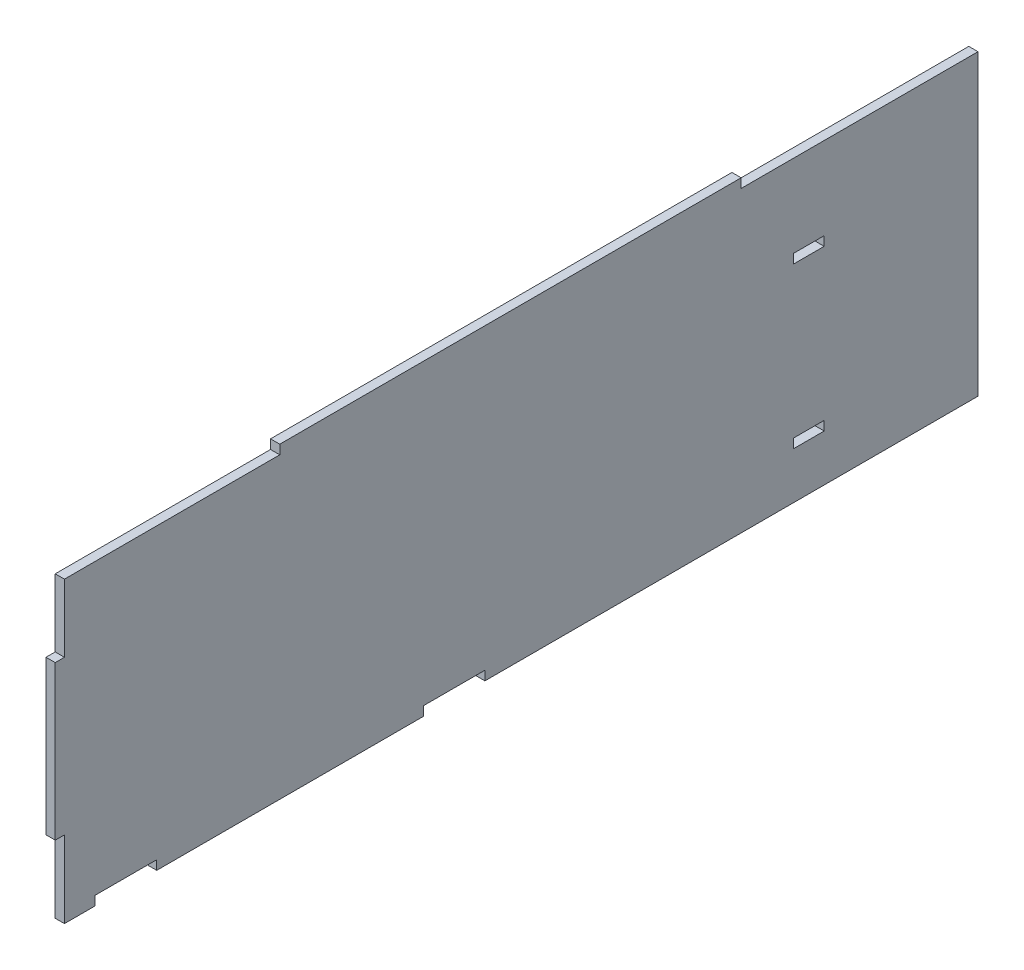
ISO-10303-21;
HEADER;
FILE_DESCRIPTION(('STEP AP214'),'2;1');
FILE_NAME('part.step','',(''),(''),'','','');
FILE_SCHEMA(('AUTOMOTIVE_DESIGN { 1 0 10303 214 1 1 1 1 }'));
ENDSEC;
DATA;
#1=APPLICATION_CONTEXT('core data for automotive mechanical design processes');
#2=APPLICATION_PROTOCOL_DEFINITION('international standard','automotive_design',2000,#1);
#3=PRODUCT_CONTEXT('',#1,'mechanical');
#4=PRODUCT('Part','Part','',(#3));
#5=PRODUCT_RELATED_PRODUCT_CATEGORY('part','',(#4));
#6=PRODUCT_DEFINITION_FORMATION('','',#4);
#7=PRODUCT_DEFINITION_CONTEXT('part definition',#1,'design');
#8=PRODUCT_DEFINITION('design','',#6,#7);
#9=PRODUCT_DEFINITION_SHAPE('','',#8);
#10=(LENGTH_UNIT() NAMED_UNIT(*) SI_UNIT(.MILLI.,.METRE.));
#11=(NAMED_UNIT(*) PLANE_ANGLE_UNIT() SI_UNIT($,.RADIAN.));
#12=(NAMED_UNIT(*) SI_UNIT($,.STERADIAN.) SOLID_ANGLE_UNIT());
#13=UNCERTAINTY_MEASURE_WITH_UNIT(LENGTH_MEASURE(1.E-05),#10,'distance_accuracy_value','');
#14=(GEOMETRIC_REPRESENTATION_CONTEXT(3) GLOBAL_UNCERTAINTY_ASSIGNED_CONTEXT((#13)) GLOBAL_UNIT_ASSIGNED_CONTEXT((#10,
#11,#12)) REPRESENTATION_CONTEXT('',''));
#15=CARTESIAN_POINT('',(0.,0.,0.));
#16=DIRECTION('',(0.,0.,1.));
#17=DIRECTION('',(1.,0.,0.));
#18=AXIS2_PLACEMENT_3D('',#15,#16,#17);
#19=CARTESIAN_POINT('',(0.,-29.636517170123,123.701897001304));
#20=DIRECTION('',(0.,0.,1.));
#21=DIRECTION('',(1.,0.,0.));
#22=AXIS2_PLACEMENT_3D('',#19,#20,#21);
#23=PLANE('',#22);
#24=DIRECTION('',(0.,-1.,0.));
#25=VECTOR('',#24,1.);
#26=CARTESIAN_POINT('',(3.,-29.636517170123,123.701897001304));
#27=LINE('',#26,#25);
#28=CARTESIAN_POINT('',(3.,-29.636517170123,123.701897001304));
#29=VERTEX_POINT('',#28);
#30=CARTESIAN_POINT('',(3.,-54.636517170123,123.701897001304));
#31=VERTEX_POINT('',#30);
#32=EDGE_CURVE('E280',#29,#31,#27,.T.);
#33=ORIENTED_EDGE('',*,*,#32,.F.);
#34=DIRECTION('',(1.,0.,0.));
#35=VECTOR('',#34,1.);
#36=CARTESIAN_POINT('',(0.,-29.636517170123,123.701897001304));
#37=LINE('',#36,#35);
#38=CARTESIAN_POINT('',(0.,-29.636517170123,123.701897001304));
#39=VERTEX_POINT('',#38);
#40=EDGE_CURVE('E11',#39,#29,#37,.T.);
#41=ORIENTED_EDGE('',*,*,#40,.F.);
#42=DIRECTION('',(0.,-1.,0.));
#43=VECTOR('',#42,1.);
#44=CARTESIAN_POINT('',(0.,-29.636517170123,123.701897001304));
#45=LINE('',#44,#43);
#46=CARTESIAN_POINT('',(0.,-54.636517170123,123.701897001304));
#47=VERTEX_POINT('',#46);
#48=EDGE_CURVE('E287',#39,#47,#45,.T.);
#49=ORIENTED_EDGE('',*,*,#48,.T.);
#50=DIRECTION('',(1.,0.,0.));
#51=VECTOR('',#50,1.);
#52=CARTESIAN_POINT('',(0.,-54.636517170123,123.701897001304));
#53=LINE('',#52,#51);
#54=EDGE_CURVE('E36',#47,#31,#53,.T.);
#55=ORIENTED_EDGE('',*,*,#54,.T.);
#56=EDGE_LOOP('',(#33,#41,#49,#55));
#57=FACE_BOUND('',#56,.T.);
#58=ADVANCED_FACE('F33',(#57),#23,.T.);
#59=CARTESIAN_POINT('',(0.,-29.636517170123,126.701897001304));
#60=DIRECTION('',(0.,-1.,0.));
#61=DIRECTION('',(0.,0.,-1.));
#62=AXIS2_PLACEMENT_3D('',#59,#60,#61);
#63=PLANE('',#62);
#64=DIRECTION('',(0.,0.,-1.));
#65=VECTOR('',#64,1.);
#66=CARTESIAN_POINT('',(3.,-29.636517170123,126.701897001304));
#67=LINE('',#66,#65);
#68=CARTESIAN_POINT('',(3.,-29.636517170123,126.701897001304));
#69=VERTEX_POINT('',#68);
#70=EDGE_CURVE('E291',#69,#29,#67,.T.);
#71=ORIENTED_EDGE('',*,*,#70,.F.);
#72=DIRECTION('',(1.,0.,0.));
#73=VECTOR('',#72,1.);
#74=CARTESIAN_POINT('',(0.,-29.636517170123,126.701897001304));
#75=LINE('',#74,#73);
#76=CARTESIAN_POINT('',(0.,-29.636517170123,126.701897001304));
#77=VERTEX_POINT('',#76);
#78=EDGE_CURVE('E41',#77,#69,#75,.T.);
#79=ORIENTED_EDGE('',*,*,#78,.F.);
#80=DIRECTION('',(0.,0.,-1.));
#81=VECTOR('',#80,1.);
#82=CARTESIAN_POINT('',(0.,-29.636517170123,126.701897001304));
#83=LINE('',#82,#81);
#84=EDGE_CURVE('E345',#77,#39,#83,.T.);
#85=ORIENTED_EDGE('',*,*,#84,.T.);
#86=ORIENTED_EDGE('',*,*,#40,.T.);
#87=EDGE_LOOP('',(#71,#79,#85,#86));
#88=FACE_BOUND('',#87,.T.);
#89=ADVANCED_FACE('F452',(#88),#63,.T.);
#90=CARTESIAN_POINT('',(0.,20.363482829877,126.701897001304));
#91=DIRECTION('',(0.,0.,1.));
#92=DIRECTION('',(1.,0.,0.));
#93=AXIS2_PLACEMENT_3D('',#90,#91,#92);
#94=PLANE('',#93);
#95=DIRECTION('',(0.,-1.,0.));
#96=VECTOR('',#95,1.);
#97=CARTESIAN_POINT('',(3.,20.363482829877,126.701897001304));
#98=LINE('',#97,#96);
#99=CARTESIAN_POINT('',(3.,20.363482829877,126.701897001304));
#100=VERTEX_POINT('',#99);
#101=EDGE_CURVE('E401',#100,#69,#98,.T.);
#102=ORIENTED_EDGE('',*,*,#101,.F.);
#103=DIRECTION('',(1.,0.,0.));
#104=VECTOR('',#103,1.);
#105=CARTESIAN_POINT('',(0.,20.363482829877,126.701897001304));
#106=LINE('',#105,#104);
#107=CARTESIAN_POINT('',(0.,20.363482829877,126.701897001304));
#108=VERTEX_POINT('',#107);
#109=EDGE_CURVE('E407',#108,#100,#106,.T.);
#110=ORIENTED_EDGE('',*,*,#109,.F.);
#111=DIRECTION('',(0.,-1.,0.));
#112=VECTOR('',#111,1.);
#113=CARTESIAN_POINT('',(0.,20.363482829877,126.701897001304));
#114=LINE('',#113,#112);
#115=EDGE_CURVE('E342',#108,#77,#114,.T.);
#116=ORIENTED_EDGE('',*,*,#115,.T.);
#117=ORIENTED_EDGE('',*,*,#78,.T.);
#118=EDGE_LOOP('',(#102,#110,#116,#117));
#119=FACE_BOUND('',#118,.T.);
#120=ADVANCED_FACE('F520',(#119),#94,.T.);
#121=CARTESIAN_POINT('',(0.,20.363482829877,123.701897001304));
#122=DIRECTION('',(0.,1.,0.));
#123=DIRECTION('',(0.,0.,1.));
#124=AXIS2_PLACEMENT_3D('',#121,#122,#123);
#125=PLANE('',#124);
#126=DIRECTION('',(0.,0.,1.));
#127=VECTOR('',#126,1.);
#128=CARTESIAN_POINT('',(3.,20.363482829877,123.701897001304));
#129=LINE('',#128,#127);
#130=CARTESIAN_POINT('',(3.,20.363482829877,123.701897001304));
#131=VERTEX_POINT('',#130);
#132=EDGE_CURVE('E398',#131,#100,#129,.T.);
#133=ORIENTED_EDGE('',*,*,#132,.F.);
#134=DIRECTION('',(1.,0.,0.));
#135=VECTOR('',#134,1.);
#136=CARTESIAN_POINT('',(0.,20.363482829877,123.701897001304));
#137=LINE('',#136,#135);
#138=CARTESIAN_POINT('',(0.,20.363482829877,123.701897001304));
#139=VERTEX_POINT('',#138);
#140=EDGE_CURVE('E409',#139,#131,#137,.T.);
#141=ORIENTED_EDGE('',*,*,#140,.F.);
#142=DIRECTION('',(0.,0.,1.));
#143=VECTOR('',#142,1.);
#144=CARTESIAN_POINT('',(0.,20.363482829877,123.701897001304));
#145=LINE('',#144,#143);
#146=EDGE_CURVE('E339',#139,#108,#145,.T.);
#147=ORIENTED_EDGE('',*,*,#146,.T.);
#148=ORIENTED_EDGE('',*,*,#109,.T.);
#149=EDGE_LOOP('',(#133,#141,#147,#148));
#150=FACE_BOUND('',#149,.T.);
#151=ADVANCED_FACE('F518',(#150),#125,.T.);
#152=CARTESIAN_POINT('',(0.,42.363482829877,123.701897001304));
#153=DIRECTION('',(0.,0.,1.));
#154=DIRECTION('',(1.,0.,0.));
#155=AXIS2_PLACEMENT_3D('',#152,#153,#154);
#156=PLANE('',#155);
#157=DIRECTION('',(0.,-1.,0.));
#158=VECTOR('',#157,1.);
#159=CARTESIAN_POINT('',(3.,42.363482829877,123.701897001304));
#160=LINE('',#159,#158);
#161=CARTESIAN_POINT('',(3.,42.363482829877,123.701897001304));
#162=VERTEX_POINT('',#161);
#163=EDGE_CURVE('E395',#162,#131,#160,.T.);
#164=ORIENTED_EDGE('',*,*,#163,.F.);
#165=DIRECTION('',(1.,0.,0.));
#166=VECTOR('',#165,1.);
#167=CARTESIAN_POINT('',(0.,42.363482829877,123.701897001304));
#168=LINE('',#167,#166);
#169=CARTESIAN_POINT('',(0.,42.363482829877,123.701897001304));
#170=VERTEX_POINT('',#169);
#171=EDGE_CURVE('E411',#170,#162,#168,.T.);
#172=ORIENTED_EDGE('',*,*,#171,.F.);
#173=DIRECTION('',(0.,-1.,0.));
#174=VECTOR('',#173,1.);
#175=CARTESIAN_POINT('',(0.,42.363482829877,123.701897001304));
#176=LINE('',#175,#174);
#177=EDGE_CURVE('E336',#170,#139,#176,.T.);
#178=ORIENTED_EDGE('',*,*,#177,.T.);
#179=ORIENTED_EDGE('',*,*,#140,.T.);
#180=EDGE_LOOP('',(#164,#172,#178,#179));
#181=FACE_BOUND('',#180,.T.);
#182=ADVANCED_FACE('F514',(#181),#156,.T.);
#183=CARTESIAN_POINT('',(0.,42.363482829877,53.7018970013037));
#184=DIRECTION('',(0.,1.,0.));
#185=DIRECTION('',(0.,0.,1.));
#186=AXIS2_PLACEMENT_3D('',#183,#184,#185);
#187=PLANE('',#186);
#188=DIRECTION('',(0.,0.,1.));
#189=VECTOR('',#188,1.);
#190=CARTESIAN_POINT('',(3.,42.363482829877,53.7018970013037));
#191=LINE('',#190,#189);
#192=CARTESIAN_POINT('',(3.,42.363482829877,53.7018970013037));
#193=VERTEX_POINT('',#192);
#194=EDGE_CURVE('E392',#193,#162,#191,.T.);
#195=ORIENTED_EDGE('',*,*,#194,.F.);
#196=DIRECTION('',(1.,0.,0.));
#197=VECTOR('',#196,1.);
#198=CARTESIAN_POINT('',(0.,42.363482829877,53.7018970013037));
#199=LINE('',#198,#197);
#200=CARTESIAN_POINT('',(0.,42.363482829877,53.7018970013037));
#201=VERTEX_POINT('',#200);
#202=EDGE_CURVE('E413',#201,#193,#199,.T.);
#203=ORIENTED_EDGE('',*,*,#202,.F.);
#204=DIRECTION('',(0.,0.,1.));
#205=VECTOR('',#204,1.);
#206=CARTESIAN_POINT('',(0.,42.363482829877,53.7018970013037));
#207=LINE('',#206,#205);
#208=EDGE_CURVE('E333',#201,#170,#207,.T.);
#209=ORIENTED_EDGE('',*,*,#208,.T.);
#210=ORIENTED_EDGE('',*,*,#171,.T.);
#211=EDGE_LOOP('',(#195,#203,#209,#210));
#212=FACE_BOUND('',#211,.T.);
#213=ADVANCED_FACE('F510',(#212),#187,.T.);
#214=CARTESIAN_POINT('',(0.,45.363482829877,53.7018970013037));
#215=DIRECTION('',(0.,0.,1.));
#216=DIRECTION('',(1.,0.,0.));
#217=AXIS2_PLACEMENT_3D('',#214,#215,#216);
#218=PLANE('',#217);
#219=DIRECTION('',(0.,-1.,0.));
#220=VECTOR('',#219,1.);
#221=CARTESIAN_POINT('',(3.,45.363482829877,53.7018970013037));
#222=LINE('',#221,#220);
#223=CARTESIAN_POINT('',(3.,45.363482829877,53.7018970013037));
#224=VERTEX_POINT('',#223);
#225=EDGE_CURVE('E389',#224,#193,#222,.T.);
#226=ORIENTED_EDGE('',*,*,#225,.F.);
#227=DIRECTION('',(1.,0.,0.));
#228=VECTOR('',#227,1.);
#229=CARTESIAN_POINT('',(0.,45.363482829877,53.7018970013037));
#230=LINE('',#229,#228);
#231=CARTESIAN_POINT('',(0.,45.363482829877,53.7018970013037));
#232=VERTEX_POINT('',#231);
#233=EDGE_CURVE('E415',#232,#224,#230,.T.);
#234=ORIENTED_EDGE('',*,*,#233,.F.);
#235=DIRECTION('',(0.,-1.,0.));
#236=VECTOR('',#235,1.);
#237=CARTESIAN_POINT('',(0.,45.363482829877,53.7018970013037));
#238=LINE('',#237,#236);
#239=EDGE_CURVE('E330',#232,#201,#238,.T.);
#240=ORIENTED_EDGE('',*,*,#239,.T.);
#241=ORIENTED_EDGE('',*,*,#202,.T.);
#242=EDGE_LOOP('',(#226,#234,#240,#241));
#243=FACE_BOUND('',#242,.T.);
#244=ADVANCED_FACE('F506',(#243),#218,.T.);
#245=CARTESIAN_POINT('',(0.,45.363482829877,-96.2981029986963));
#246=DIRECTION('',(0.,1.,0.));
#247=DIRECTION('',(0.,0.,1.));
#248=AXIS2_PLACEMENT_3D('',#245,#246,#247);
#249=PLANE('',#248);
#250=DIRECTION('',(0.,0.,1.));
#251=VECTOR('',#250,1.);
#252=CARTESIAN_POINT('',(3.,45.363482829877,-96.2981029986963));
#253=LINE('',#252,#251);
#254=CARTESIAN_POINT('',(3.,45.363482829877,-96.2981029986963));
#255=VERTEX_POINT('',#254);
#256=EDGE_CURVE('E386',#255,#224,#253,.T.);
#257=ORIENTED_EDGE('',*,*,#256,.F.);
#258=DIRECTION('',(1.,0.,0.));
#259=VECTOR('',#258,1.);
#260=CARTESIAN_POINT('',(0.,45.363482829877,-96.2981029986963));
#261=LINE('',#260,#259);
#262=CARTESIAN_POINT('',(0.,45.363482829877,-96.2981029986963));
#263=VERTEX_POINT('',#262);
#264=EDGE_CURVE('E417',#263,#255,#261,.T.);
#265=ORIENTED_EDGE('',*,*,#264,.F.);
#266=DIRECTION('',(0.,0.,1.));
#267=VECTOR('',#266,1.);
#268=CARTESIAN_POINT('',(0.,45.363482829877,-96.2981029986963));
#269=LINE('',#268,#267);
#270=EDGE_CURVE('E327',#263,#232,#269,.T.);
#271=ORIENTED_EDGE('',*,*,#270,.T.);
#272=ORIENTED_EDGE('',*,*,#233,.T.);
#273=EDGE_LOOP('',(#257,#265,#271,#272));
#274=FACE_BOUND('',#273,.T.);
#275=ADVANCED_FACE('F502',(#274),#249,.T.);
#276=CARTESIAN_POINT('',(0.,42.363482829877,-96.2981029986963));
#277=DIRECTION('',(0.,0.,-1.));
#278=DIRECTION('',(-1.,0.,0.));
#279=AXIS2_PLACEMENT_3D('',#276,#277,#278);
#280=PLANE('',#279);
#281=DIRECTION('',(0.,1.,0.));
#282=VECTOR('',#281,1.);
#283=CARTESIAN_POINT('',(3.,42.363482829877,-96.2981029986963));
#284=LINE('',#283,#282);
#285=CARTESIAN_POINT('',(3.,42.363482829877,-96.2981029986963));
#286=VERTEX_POINT('',#285);
#287=EDGE_CURVE('E383',#286,#255,#284,.T.);
#288=ORIENTED_EDGE('',*,*,#287,.F.);
#289=DIRECTION('',(1.,0.,0.));
#290=VECTOR('',#289,1.);
#291=CARTESIAN_POINT('',(0.,42.363482829877,-96.2981029986963));
#292=LINE('',#291,#290);
#293=CARTESIAN_POINT('',(0.,42.363482829877,-96.2981029986963));
#294=VERTEX_POINT('',#293);
#295=EDGE_CURVE('E419',#294,#286,#292,.T.);
#296=ORIENTED_EDGE('',*,*,#295,.F.);
#297=DIRECTION('',(0.,1.,0.));
#298=VECTOR('',#297,1.);
#299=CARTESIAN_POINT('',(0.,42.363482829877,-96.2981029986963));
#300=LINE('',#299,#298);
#301=EDGE_CURVE('E324',#294,#263,#300,.T.);
#302=ORIENTED_EDGE('',*,*,#301,.T.);
#303=ORIENTED_EDGE('',*,*,#264,.T.);
#304=EDGE_LOOP('',(#288,#296,#302,#303));
#305=FACE_BOUND('',#304,.T.);
#306=ADVANCED_FACE('F498',(#305),#280,.T.);
#307=CARTESIAN_POINT('',(0.,42.363482829877,-173.298102998696));
#308=DIRECTION('',(0.,1.,0.));
#309=DIRECTION('',(0.,0.,1.));
#310=AXIS2_PLACEMENT_3D('',#307,#308,#309);
#311=PLANE('',#310);
#312=DIRECTION('',(0.,0.,1.));
#313=VECTOR('',#312,1.);
#314=CARTESIAN_POINT('',(3.,42.363482829877,-173.298102998696));
#315=LINE('',#314,#313);
#316=CARTESIAN_POINT('',(3.,42.363482829877,-173.298102998696));
#317=VERTEX_POINT('',#316);
#318=EDGE_CURVE('E380',#317,#286,#315,.T.);
#319=ORIENTED_EDGE('',*,*,#318,.F.);
#320=DIRECTION('',(1.,0.,0.));
#321=VECTOR('',#320,1.);
#322=CARTESIAN_POINT('',(0.,42.363482829877,-173.298102998696));
#323=LINE('',#322,#321);
#324=CARTESIAN_POINT('',(0.,42.363482829877,-173.298102998696));
#325=VERTEX_POINT('',#324);
#326=EDGE_CURVE('E421',#325,#317,#323,.T.);
#327=ORIENTED_EDGE('',*,*,#326,.F.);
#328=DIRECTION('',(0.,0.,1.));
#329=VECTOR('',#328,1.);
#330=CARTESIAN_POINT('',(0.,42.363482829877,-173.298102998696));
#331=LINE('',#330,#329);
#332=EDGE_CURVE('E321',#325,#294,#331,.T.);
#333=ORIENTED_EDGE('',*,*,#332,.T.);
#334=ORIENTED_EDGE('',*,*,#295,.T.);
#335=EDGE_LOOP('',(#319,#327,#333,#334));
#336=FACE_BOUND('',#335,.T.);
#337=ADVANCED_FACE('F494',(#336),#311,.T.);
#338=CARTESIAN_POINT('',(0.,-54.636517170123,-173.298102998696));
#339=DIRECTION('',(0.,0.,-1.));
#340=DIRECTION('',(-1.,0.,0.));
#341=AXIS2_PLACEMENT_3D('',#338,#339,#340);
#342=PLANE('',#341);
#343=DIRECTION('',(0.,1.,0.));
#344=VECTOR('',#343,1.);
#345=CARTESIAN_POINT('',(3.,-54.636517170123,-173.298102998696));
#346=LINE('',#345,#344);
#347=CARTESIAN_POINT('',(3.,-54.636517170123,-173.298102998696));
#348=VERTEX_POINT('',#347);
#349=EDGE_CURVE('E377',#348,#317,#346,.T.);
#350=ORIENTED_EDGE('',*,*,#349,.F.);
#351=DIRECTION('',(1.,0.,0.));
#352=VECTOR('',#351,1.);
#353=CARTESIAN_POINT('',(0.,-54.636517170123,-173.298102998696));
#354=LINE('',#353,#352);
#355=CARTESIAN_POINT('',(0.,-54.636517170123,-173.298102998696));
#356=VERTEX_POINT('',#355);
#357=EDGE_CURVE('E423',#356,#348,#354,.T.);
#358=ORIENTED_EDGE('',*,*,#357,.F.);
#359=DIRECTION('',(0.,1.,0.));
#360=VECTOR('',#359,1.);
#361=CARTESIAN_POINT('',(0.,-54.636517170123,-173.298102998696));
#362=LINE('',#361,#360);
#363=EDGE_CURVE('E318',#356,#325,#362,.T.);
#364=ORIENTED_EDGE('',*,*,#363,.T.);
#365=ORIENTED_EDGE('',*,*,#326,.T.);
#366=EDGE_LOOP('',(#350,#358,#364,#365));
#367=FACE_BOUND('',#366,.T.);
#368=ADVANCED_FACE('F490',(#367),#342,.T.);
#369=CARTESIAN_POINT('',(0.,-54.636517170123,-12.9981029986962));
#370=DIRECTION('',(0.,-1.,0.));
#371=DIRECTION('',(0.,0.,-1.));
#372=AXIS2_PLACEMENT_3D('',#369,#370,#371);
#373=PLANE('',#372);
#374=DIRECTION('',(0.,0.,-1.));
#375=VECTOR('',#374,1.);
#376=CARTESIAN_POINT('',(3.,-54.636517170123,-12.9981029986962));
#377=LINE('',#376,#375);
#378=CARTESIAN_POINT('',(3.,-54.636517170123,-12.9981029986962));
#379=VERTEX_POINT('',#378);
#380=EDGE_CURVE('E374',#379,#348,#377,.T.);
#381=ORIENTED_EDGE('',*,*,#380,.F.);
#382=DIRECTION('',(1.,0.,0.));
#383=VECTOR('',#382,1.);
#384=CARTESIAN_POINT('',(0.,-54.636517170123,-12.9981029986962));
#385=LINE('',#384,#383);
#386=CARTESIAN_POINT('',(0.,-54.636517170123,-12.9981029986962));
#387=VERTEX_POINT('',#386);
#388=EDGE_CURVE('E425',#387,#379,#385,.T.);
#389=ORIENTED_EDGE('',*,*,#388,.F.);
#390=DIRECTION('',(0.,0.,-1.));
#391=VECTOR('',#390,1.);
#392=CARTESIAN_POINT('',(0.,-54.636517170123,-12.9981029986962));
#393=LINE('',#392,#391);
#394=EDGE_CURVE('E315',#387,#356,#393,.T.);
#395=ORIENTED_EDGE('',*,*,#394,.T.);
#396=ORIENTED_EDGE('',*,*,#357,.T.);
#397=EDGE_LOOP('',(#381,#389,#395,#396));
#398=FACE_BOUND('',#397,.T.);
#399=ADVANCED_FACE('F486',(#398),#373,.T.);
#400=CARTESIAN_POINT('',(0.,-51.636517170123,-12.9981029986963));
#401=DIRECTION('',(0.,0.,1.));
#402=DIRECTION('',(0.,-1.,0.));
#403=AXIS2_PLACEMENT_3D('',#400,#401,#402);
#404=PLANE('',#403);
#405=DIRECTION('',(0.,-1.,0.));
#406=VECTOR('',#405,1.);
#407=CARTESIAN_POINT('',(3.,-51.636517170123,-12.9981029986963));
#408=LINE('',#407,#406);
#409=CARTESIAN_POINT('',(3.,-51.636517170123,-12.9981029986963));
#410=VERTEX_POINT('',#409);
#411=EDGE_CURVE('E371',#410,#379,#408,.T.);
#412=ORIENTED_EDGE('',*,*,#411,.F.);
#413=DIRECTION('',(1.,0.,0.));
#414=VECTOR('',#413,1.);
#415=CARTESIAN_POINT('',(0.,-51.636517170123,-12.9981029986963));
#416=LINE('',#415,#414);
#417=CARTESIAN_POINT('',(0.,-51.636517170123,-12.9981029986963));
#418=VERTEX_POINT('',#417);
#419=EDGE_CURVE('E427',#418,#410,#416,.T.);
#420=ORIENTED_EDGE('',*,*,#419,.F.);
#421=DIRECTION('',(0.,-1.,0.));
#422=VECTOR('',#421,1.);
#423=CARTESIAN_POINT('',(0.,-51.636517170123,-12.9981029986963));
#424=LINE('',#423,#422);
#425=EDGE_CURVE('E312',#418,#387,#424,.T.);
#426=ORIENTED_EDGE('',*,*,#425,.T.);
#427=ORIENTED_EDGE('',*,*,#388,.T.);
#428=EDGE_LOOP('',(#412,#420,#426,#427));
#429=FACE_BOUND('',#428,.T.);
#430=ADVANCED_FACE('F482',(#429),#404,.T.);
#431=CARTESIAN_POINT('',(0.,-51.636517170123,7.00189700130374));
#432=DIRECTION('',(0.,-1.,0.));
#433=DIRECTION('',(0.,0.,-1.));
#434=AXIS2_PLACEMENT_3D('',#431,#432,#433);
#435=PLANE('',#434);
#436=DIRECTION('',(0.,0.,-1.));
#437=VECTOR('',#436,1.);
#438=CARTESIAN_POINT('',(3.,-51.636517170123,7.00189700130374));
#439=LINE('',#438,#437);
#440=CARTESIAN_POINT('',(3.,-51.636517170123,7.00189700130374));
#441=VERTEX_POINT('',#440);
#442=EDGE_CURVE('E368',#441,#410,#439,.T.);
#443=ORIENTED_EDGE('',*,*,#442,.F.);
#444=DIRECTION('',(1.,0.,0.));
#445=VECTOR('',#444,1.);
#446=CARTESIAN_POINT('',(0.,-51.636517170123,7.00189700130374));
#447=LINE('',#446,#445);
#448=CARTESIAN_POINT('',(0.,-51.636517170123,7.00189700130374));
#449=VERTEX_POINT('',#448);
#450=EDGE_CURVE('E429',#449,#441,#447,.T.);
#451=ORIENTED_EDGE('',*,*,#450,.F.);
#452=DIRECTION('',(0.,0.,-1.));
#453=VECTOR('',#452,1.);
#454=CARTESIAN_POINT('',(0.,-51.636517170123,7.00189700130374));
#455=LINE('',#454,#453);
#456=EDGE_CURVE('E309',#449,#418,#455,.T.);
#457=ORIENTED_EDGE('',*,*,#456,.T.);
#458=ORIENTED_EDGE('',*,*,#419,.T.);
#459=EDGE_LOOP('',(#443,#451,#457,#458));
#460=FACE_BOUND('',#459,.T.);
#461=ADVANCED_FACE('F478',(#460),#435,.T.);
#462=CARTESIAN_POINT('',(0.,-54.636517170123,7.00189700130374));
#463=DIRECTION('',(0.,0.,-1.));
#464=DIRECTION('',(-1.,0.,0.));
#465=AXIS2_PLACEMENT_3D('',#462,#463,#464);
#466=PLANE('',#465);
#467=DIRECTION('',(0.,1.,0.));
#468=VECTOR('',#467,1.);
#469=CARTESIAN_POINT('',(3.,-54.636517170123,7.00189700130374));
#470=LINE('',#469,#468);
#471=CARTESIAN_POINT('',(3.,-54.636517170123,7.00189700130374));
#472=VERTEX_POINT('',#471);
#473=EDGE_CURVE('E365',#472,#441,#470,.T.);
#474=ORIENTED_EDGE('',*,*,#473,.F.);
#475=DIRECTION('',(1.,0.,0.));
#476=VECTOR('',#475,1.);
#477=CARTESIAN_POINT('',(0.,-54.636517170123,7.00189700130374));
#478=LINE('',#477,#476);
#479=CARTESIAN_POINT('',(0.,-54.636517170123,7.00189700130374));
#480=VERTEX_POINT('',#479);
#481=EDGE_CURVE('E431',#480,#472,#478,.T.);
#482=ORIENTED_EDGE('',*,*,#481,.F.);
#483=DIRECTION('',(0.,1.,0.));
#484=VECTOR('',#483,1.);
#485=CARTESIAN_POINT('',(0.,-54.636517170123,7.00189700130374));
#486=LINE('',#485,#484);
#487=EDGE_CURVE('E306',#480,#449,#486,.T.);
#488=ORIENTED_EDGE('',*,*,#487,.T.);
#489=ORIENTED_EDGE('',*,*,#450,.T.);
#490=EDGE_LOOP('',(#474,#482,#488,#489));
#491=FACE_BOUND('',#490,.T.);
#492=ADVANCED_FACE('F474',(#491),#466,.T.);
#493=CARTESIAN_POINT('',(0.,-54.636517170123,93.7018970013037));
#494=DIRECTION('',(0.,-1.,0.));
#495=DIRECTION('',(0.,0.,-1.));
#496=AXIS2_PLACEMENT_3D('',#493,#494,#495);
#497=PLANE('',#496);
#498=DIRECTION('',(0.,0.,-1.));
#499=VECTOR('',#498,1.);
#500=CARTESIAN_POINT('',(3.,-54.636517170123,93.7018970013037));
#501=LINE('',#500,#499);
#502=CARTESIAN_POINT('',(3.,-54.636517170123,93.7018970013037));
#503=VERTEX_POINT('',#502);
#504=EDGE_CURVE('E362',#503,#472,#501,.T.);
#505=ORIENTED_EDGE('',*,*,#504,.F.);
#506=DIRECTION('',(1.,0.,0.));
#507=VECTOR('',#506,1.);
#508=CARTESIAN_POINT('',(0.,-54.636517170123,93.7018970013037));
#509=LINE('',#508,#507);
#510=CARTESIAN_POINT('',(0.,-54.636517170123,93.7018970013037));
#511=VERTEX_POINT('',#510);
#512=EDGE_CURVE('E433',#511,#503,#509,.T.);
#513=ORIENTED_EDGE('',*,*,#512,.F.);
#514=DIRECTION('',(0.,0.,-1.));
#515=VECTOR('',#514,1.);
#516=CARTESIAN_POINT('',(0.,-54.636517170123,93.7018970013037));
#517=LINE('',#516,#515);
#518=EDGE_CURVE('E303',#511,#480,#517,.T.);
#519=ORIENTED_EDGE('',*,*,#518,.T.);
#520=ORIENTED_EDGE('',*,*,#481,.T.);
#521=EDGE_LOOP('',(#505,#513,#519,#520));
#522=FACE_BOUND('',#521,.T.);
#523=ADVANCED_FACE('F470',(#522),#497,.T.);
#524=CARTESIAN_POINT('',(0.,-51.636517170123,93.7018970013037));
#525=DIRECTION('',(0.,0.,1.));
#526=DIRECTION('',(1.,0.,0.));
#527=AXIS2_PLACEMENT_3D('',#524,#525,#526);
#528=PLANE('',#527);
#529=DIRECTION('',(0.,-1.,0.));
#530=VECTOR('',#529,1.);
#531=CARTESIAN_POINT('',(3.,-51.636517170123,93.7018970013037));
#532=LINE('',#531,#530);
#533=CARTESIAN_POINT('',(3.,-51.636517170123,93.7018970013037));
#534=VERTEX_POINT('',#533);
#535=EDGE_CURVE('E359',#534,#503,#532,.T.);
#536=ORIENTED_EDGE('',*,*,#535,.F.);
#537=DIRECTION('',(1.,0.,0.));
#538=VECTOR('',#537,1.);
#539=CARTESIAN_POINT('',(0.,-51.636517170123,93.7018970013037));
#540=LINE('',#539,#538);
#541=CARTESIAN_POINT('',(0.,-51.636517170123,93.7018970013037));
#542=VERTEX_POINT('',#541);
#543=EDGE_CURVE('E435',#542,#534,#540,.T.);
#544=ORIENTED_EDGE('',*,*,#543,.F.);
#545=DIRECTION('',(0.,-1.,0.));
#546=VECTOR('',#545,1.);
#547=CARTESIAN_POINT('',(0.,-51.636517170123,93.7018970013037));
#548=LINE('',#547,#546);
#549=EDGE_CURVE('E300',#542,#511,#548,.T.);
#550=ORIENTED_EDGE('',*,*,#549,.T.);
#551=ORIENTED_EDGE('',*,*,#512,.T.);
#552=EDGE_LOOP('',(#536,#544,#550,#551));
#553=FACE_BOUND('',#552,.T.);
#554=ADVANCED_FACE('F466',(#553),#528,.T.);
#555=CARTESIAN_POINT('',(0.,-51.636517170123,113.701897001304));
#556=DIRECTION('',(0.,-1.,0.));
#557=DIRECTION('',(0.,0.,-1.));
#558=AXIS2_PLACEMENT_3D('',#555,#556,#557);
#559=PLANE('',#558);
#560=DIRECTION('',(0.,0.,-1.));
#561=VECTOR('',#560,1.);
#562=CARTESIAN_POINT('',(3.,-51.636517170123,113.701897001304));
#563=LINE('',#562,#561);
#564=CARTESIAN_POINT('',(3.,-51.636517170123,113.701897001304));
#565=VERTEX_POINT('',#564);
#566=EDGE_CURVE('E356',#565,#534,#563,.T.);
#567=ORIENTED_EDGE('',*,*,#566,.F.);
#568=DIRECTION('',(1.,0.,0.));
#569=VECTOR('',#568,1.);
#570=CARTESIAN_POINT('',(0.,-51.636517170123,113.701897001304));
#571=LINE('',#570,#569);
#572=CARTESIAN_POINT('',(0.,-51.636517170123,113.701897001304));
#573=VERTEX_POINT('',#572);
#574=EDGE_CURVE('E437',#573,#565,#571,.T.);
#575=ORIENTED_EDGE('',*,*,#574,.F.);
#576=DIRECTION('',(0.,0.,-1.));
#577=VECTOR('',#576,1.);
#578=CARTESIAN_POINT('',(0.,-51.636517170123,113.701897001304));
#579=LINE('',#578,#577);
#580=EDGE_CURVE('E297',#573,#542,#579,.T.);
#581=ORIENTED_EDGE('',*,*,#580,.T.);
#582=ORIENTED_EDGE('',*,*,#543,.T.);
#583=EDGE_LOOP('',(#567,#575,#581,#582));
#584=FACE_BOUND('',#583,.T.);
#585=ADVANCED_FACE('F464',(#584),#559,.T.);
#586=CARTESIAN_POINT('',(0.,-54.636517170123,113.701897001304));
#587=DIRECTION('',(0.,0.,-1.));
#588=DIRECTION('',(-1.,0.,0.));
#589=AXIS2_PLACEMENT_3D('',#586,#587,#588);
#590=PLANE('',#589);
#591=DIRECTION('',(0.,1.,0.));
#592=VECTOR('',#591,1.);
#593=CARTESIAN_POINT('',(3.,-54.636517170123,113.701897001304));
#594=LINE('',#593,#592);
#595=CARTESIAN_POINT('',(3.,-54.636517170123,113.701897001304));
#596=VERTEX_POINT('',#595);
#597=EDGE_CURVE('E353',#596,#565,#594,.T.);
#598=ORIENTED_EDGE('',*,*,#597,.F.);
#599=DIRECTION('',(1.,0.,0.));
#600=VECTOR('',#599,1.);
#601=CARTESIAN_POINT('',(0.,-54.636517170123,113.701897001304));
#602=LINE('',#601,#600);
#603=CARTESIAN_POINT('',(0.,-54.636517170123,113.701897001304));
#604=VERTEX_POINT('',#603);
#605=EDGE_CURVE('E438',#604,#596,#602,.T.);
#606=ORIENTED_EDGE('',*,*,#605,.F.);
#607=DIRECTION('',(0.,1.,0.));
#608=VECTOR('',#607,1.);
#609=CARTESIAN_POINT('',(0.,-54.636517170123,113.701897001304));
#610=LINE('',#609,#608);
#611=EDGE_CURVE('E294',#604,#573,#610,.T.);
#612=ORIENTED_EDGE('',*,*,#611,.T.);
#613=ORIENTED_EDGE('',*,*,#574,.T.);
#614=EDGE_LOOP('',(#598,#606,#612,#613));
#615=FACE_BOUND('',#614,.T.);
#616=ADVANCED_FACE('F460',(#615),#590,.T.);
#617=CARTESIAN_POINT('',(0.,-54.636517170123,123.701897001304));
#618=DIRECTION('',(0.,-1.,0.));
#619=DIRECTION('',(0.,0.,-1.));
#620=AXIS2_PLACEMENT_3D('',#617,#618,#619);
#621=PLANE('',#620);
#622=DIRECTION('',(0.,0.,-1.));
#623=VECTOR('',#622,1.);
#624=CARTESIAN_POINT('',(3.,-54.636517170123,123.701897001304));
#625=LINE('',#624,#623);
#626=EDGE_CURVE('E350',#31,#596,#625,.T.);
#627=ORIENTED_EDGE('',*,*,#626,.F.);
#628=ORIENTED_EDGE('',*,*,#54,.F.);
#629=DIRECTION('',(0.,0.,-1.));
#630=VECTOR('',#629,1.);
#631=CARTESIAN_POINT('',(0.,-54.636517170123,123.701897001304));
#632=LINE('',#631,#630);
#633=EDGE_CURVE('E290',#47,#604,#632,.T.);
#634=ORIENTED_EDGE('',*,*,#633,.T.);
#635=ORIENTED_EDGE('',*,*,#605,.T.);
#636=EDGE_LOOP('',(#627,#628,#634,#635));
#637=FACE_BOUND('',#636,.T.);
#638=ADVANCED_FACE('F446',(#637),#621,.T.);
#639=CARTESIAN_POINT('',(0.,0.,0.));
#640=DIRECTION('',(1.,0.,0.));
#641=DIRECTION('',(0.,0.,-1.));
#642=AXIS2_PLACEMENT_3D('',#639,#640,#641);
#643=PLANE('',#642);
#644=DIRECTION('',(0.,-1.,0.));
#645=VECTOR('',#644,1.);
#646=CARTESIAN_POINT('',(0.,12.563482829877,-113.298102998696));
#647=LINE('',#646,#645);
#648=CARTESIAN_POINT('',(0.,15.563482829877,-113.298102998696));
#649=VERTEX_POINT('',#648);
#650=CARTESIAN_POINT('',(0.,12.563482829877,-113.298102998696));
#651=VERTEX_POINT('',#650);
#652=EDGE_CURVE('E226',#649,#651,#647,.T.);
#653=ORIENTED_EDGE('',*,*,#652,.T.);
#654=DIRECTION('',(0.,0.,-1.));
#655=VECTOR('',#654,1.);
#656=CARTESIAN_POINT('',(0.,12.563482829877,-123.298102998696));
#657=LINE('',#656,#655);
#658=CARTESIAN_POINT('',(0.,12.563482829877,-123.298102998696));
#659=VERTEX_POINT('',#658);
#660=EDGE_CURVE('E220',#651,#659,#657,.T.);
#661=ORIENTED_EDGE('',*,*,#660,.T.);
#662=DIRECTION('',(0.,1.,0.));
#663=VECTOR('',#662,1.);
#664=CARTESIAN_POINT('',(0.,15.563482829877,-123.298102998696));
#665=LINE('',#664,#663);
#666=CARTESIAN_POINT('',(0.,15.563482829877,-123.298102998696));
#667=VERTEX_POINT('',#666);
#668=EDGE_CURVE('E229',#659,#667,#665,.T.);
#669=ORIENTED_EDGE('',*,*,#668,.T.);
#670=DIRECTION('',(0.,0.,1.));
#671=VECTOR('',#670,1.);
#672=CARTESIAN_POINT('',(0.,15.563482829877,-113.298102998696));
#673=LINE('',#672,#671);
#674=EDGE_CURVE('E49',#667,#649,#673,.T.);
#675=ORIENTED_EDGE('',*,*,#674,.T.);
#676=EDGE_LOOP('',(#653,#661,#669,#675));
#677=FACE_BOUND('',#676,.T.);
#678=DIRECTION('',(0.,1.,0.));
#679=VECTOR('',#678,1.);
#680=CARTESIAN_POINT('',(0.,-36.436517170123,-123.298102998696));
#681=LINE('',#680,#679);
#682=CARTESIAN_POINT('',(0.,-39.436517170123,-123.298102998696));
#683=VERTEX_POINT('',#682);
#684=CARTESIAN_POINT('',(0.,-36.436517170123,-123.298102998696));
#685=VERTEX_POINT('',#684);
#686=EDGE_CURVE('E265',#683,#685,#681,.T.);
#687=ORIENTED_EDGE('',*,*,#686,.T.);
#688=DIRECTION('',(0.,0.,1.));
#689=VECTOR('',#688,1.);
#690=CARTESIAN_POINT('',(0.,-36.436517170123,-113.298102998696));
#691=LINE('',#690,#689);
#692=CARTESIAN_POINT('',(0.,-36.436517170123,-113.298102998696));
#693=VERTEX_POINT('',#692);
#694=EDGE_CURVE('E255',#685,#693,#691,.T.);
#695=ORIENTED_EDGE('',*,*,#694,.T.);
#696=DIRECTION('',(0.,-1.,0.));
#697=VECTOR('',#696,1.);
#698=CARTESIAN_POINT('',(0.,-39.436517170123,-113.298102998696));
#699=LINE('',#698,#697);
#700=CARTESIAN_POINT('',(0.,-39.436517170123,-113.298102998696));
#701=VERTEX_POINT('',#700);
#702=EDGE_CURVE('E258',#693,#701,#699,.T.);
#703=ORIENTED_EDGE('',*,*,#702,.T.);
#704=DIRECTION('',(0.,0.,-1.));
#705=VECTOR('',#704,1.);
#706=CARTESIAN_POINT('',(0.,-39.436517170123,-123.298102998696));
#707=LINE('',#706,#705);
#708=EDGE_CURVE('E262',#701,#683,#707,.T.);
#709=ORIENTED_EDGE('',*,*,#708,.T.);
#710=EDGE_LOOP('',(#687,#695,#703,#709));
#711=FACE_BOUND('',#710,.T.);
#712=ORIENTED_EDGE('',*,*,#48,.F.);
#713=ORIENTED_EDGE('',*,*,#84,.F.);
#714=ORIENTED_EDGE('',*,*,#115,.F.);
#715=ORIENTED_EDGE('',*,*,#146,.F.);
#716=ORIENTED_EDGE('',*,*,#177,.F.);
#717=ORIENTED_EDGE('',*,*,#208,.F.);
#718=ORIENTED_EDGE('',*,*,#239,.F.);
#719=ORIENTED_EDGE('',*,*,#270,.F.);
#720=ORIENTED_EDGE('',*,*,#301,.F.);
#721=ORIENTED_EDGE('',*,*,#332,.F.);
#722=ORIENTED_EDGE('',*,*,#363,.F.);
#723=ORIENTED_EDGE('',*,*,#394,.F.);
#724=ORIENTED_EDGE('',*,*,#425,.F.);
#725=ORIENTED_EDGE('',*,*,#456,.F.);
#726=ORIENTED_EDGE('',*,*,#487,.F.);
#727=ORIENTED_EDGE('',*,*,#518,.F.);
#728=ORIENTED_EDGE('',*,*,#549,.F.);
#729=ORIENTED_EDGE('',*,*,#580,.F.);
#730=ORIENTED_EDGE('',*,*,#611,.F.);
#731=ORIENTED_EDGE('',*,*,#633,.F.);
#732=EDGE_LOOP('',(#712,#713,#714,#715,#716,#717,#718,#719,#720,#721,#722,#723,#724,#725,#726,
#727,#728,#729,#730,#731));
#733=FACE_BOUND('',#732,.T.);
#734=ADVANCED_FACE('F233',(#677,#711,#733),#643,.F.);
#735=CARTESIAN_POINT('',(3.,0.,0.));
#736=DIRECTION('',(1.,0.,0.));
#737=DIRECTION('',(0.,0.,-1.));
#738=AXIS2_PLACEMENT_3D('',#735,#736,#737);
#739=PLANE('',#738);
#740=DIRECTION('',(0.,0.,-1.));
#741=VECTOR('',#740,1.);
#742=CARTESIAN_POINT('',(3.,12.563482829877,-123.298102998696));
#743=LINE('',#742,#741);
#744=CARTESIAN_POINT('',(3.,12.563482829877,-113.298102998696));
#745=VERTEX_POINT('',#744);
#746=CARTESIAN_POINT('',(3.,12.563482829877,-123.298102998696));
#747=VERTEX_POINT('',#746);
#748=EDGE_CURVE('E57',#745,#747,#743,.T.);
#749=ORIENTED_EDGE('',*,*,#748,.F.);
#750=DIRECTION('',(0.,-1.,0.));
#751=VECTOR('',#750,1.);
#752=CARTESIAN_POINT('',(3.,12.563482829877,-113.298102998696));
#753=LINE('',#752,#751);
#754=CARTESIAN_POINT('',(3.,15.563482829877,-113.298102998696));
#755=VERTEX_POINT('',#754);
#756=EDGE_CURVE('E236',#755,#745,#753,.T.);
#757=ORIENTED_EDGE('',*,*,#756,.F.);
#758=DIRECTION('',(0.,0.,1.));
#759=VECTOR('',#758,1.);
#760=CARTESIAN_POINT('',(3.,15.563482829877,-113.298102998696));
#761=LINE('',#760,#759);
#762=CARTESIAN_POINT('',(3.,15.563482829877,-123.298102998696));
#763=VERTEX_POINT('',#762);
#764=EDGE_CURVE('E239',#763,#755,#761,.T.);
#765=ORIENTED_EDGE('',*,*,#764,.F.);
#766=DIRECTION('',(0.,1.,0.));
#767=VECTOR('',#766,1.);
#768=CARTESIAN_POINT('',(3.,15.563482829877,-123.298102998696));
#769=LINE('',#768,#767);
#770=EDGE_CURVE('E245',#747,#763,#769,.T.);
#771=ORIENTED_EDGE('',*,*,#770,.F.);
#772=EDGE_LOOP('',(#749,#757,#765,#771));
#773=FACE_BOUND('',#772,.T.);
#774=DIRECTION('',(0.,0.,1.));
#775=VECTOR('',#774,1.);
#776=CARTESIAN_POINT('',(3.,-36.436517170123,-113.298102998696));
#777=LINE('',#776,#775);
#778=CARTESIAN_POINT('',(3.,-36.436517170123,-123.298102998696));
#779=VERTEX_POINT('',#778);
#780=CARTESIAN_POINT('',(3.,-36.436517170123,-113.298102998696));
#781=VERTEX_POINT('',#780);
#782=EDGE_CURVE('E251',#779,#781,#777,.T.);
#783=ORIENTED_EDGE('',*,*,#782,.F.);
#784=DIRECTION('',(0.,1.,0.));
#785=VECTOR('',#784,1.);
#786=CARTESIAN_POINT('',(3.,-36.436517170123,-123.298102998696));
#787=LINE('',#786,#785);
#788=CARTESIAN_POINT('',(3.,-39.436517170123,-123.298102998696));
#789=VERTEX_POINT('',#788);
#790=EDGE_CURVE('E259',#789,#779,#787,.T.);
#791=ORIENTED_EDGE('',*,*,#790,.F.);
#792=DIRECTION('',(0.,0.,-1.));
#793=VECTOR('',#792,1.);
#794=CARTESIAN_POINT('',(3.,-39.436517170123,-123.298102998696));
#795=LINE('',#794,#793);
#796=CARTESIAN_POINT('',(3.,-39.436517170123,-113.298102998696));
#797=VERTEX_POINT('',#796);
#798=EDGE_CURVE('E273',#797,#789,#795,.T.);
#799=ORIENTED_EDGE('',*,*,#798,.F.);
#800=DIRECTION('',(0.,-1.,0.));
#801=VECTOR('',#800,1.);
#802=CARTESIAN_POINT('',(3.,-39.436517170123,-113.298102998696));
#803=LINE('',#802,#801);
#804=EDGE_CURVE('E270',#781,#797,#803,.T.);
#805=ORIENTED_EDGE('',*,*,#804,.F.);
#806=EDGE_LOOP('',(#783,#791,#799,#805));
#807=FACE_BOUND('',#806,.T.);
#808=ORIENTED_EDGE('',*,*,#32,.T.);
#809=ORIENTED_EDGE('',*,*,#626,.T.);
#810=ORIENTED_EDGE('',*,*,#597,.T.);
#811=ORIENTED_EDGE('',*,*,#566,.T.);
#812=ORIENTED_EDGE('',*,*,#535,.T.);
#813=ORIENTED_EDGE('',*,*,#504,.T.);
#814=ORIENTED_EDGE('',*,*,#473,.T.);
#815=ORIENTED_EDGE('',*,*,#442,.T.);
#816=ORIENTED_EDGE('',*,*,#411,.T.);
#817=ORIENTED_EDGE('',*,*,#380,.T.);
#818=ORIENTED_EDGE('',*,*,#349,.T.);
#819=ORIENTED_EDGE('',*,*,#318,.T.);
#820=ORIENTED_EDGE('',*,*,#287,.T.);
#821=ORIENTED_EDGE('',*,*,#256,.T.);
#822=ORIENTED_EDGE('',*,*,#225,.T.);
#823=ORIENTED_EDGE('',*,*,#194,.T.);
#824=ORIENTED_EDGE('',*,*,#163,.T.);
#825=ORIENTED_EDGE('',*,*,#132,.T.);
#826=ORIENTED_EDGE('',*,*,#101,.T.);
#827=ORIENTED_EDGE('',*,*,#70,.T.);
#828=EDGE_LOOP('',(#808,#809,#810,#811,#812,#813,#814,#815,#816,#817,#818,#819,#820,#821,#822,
#823,#824,#825,#826,#827));
#829=FACE_BOUND('',#828,.T.);
#830=ADVANCED_FACE('F448',(#773,#807,#829),#739,.T.);
#831=CARTESIAN_POINT('',(0.,-36.436517170123,-113.298102998696));
#832=DIRECTION('',(0.,1.,0.));
#833=DIRECTION('',(0.,0.,1.));
#834=AXIS2_PLACEMENT_3D('',#831,#832,#833);
#835=PLANE('',#834);
#836=ORIENTED_EDGE('',*,*,#782,.T.);
#837=DIRECTION('',(1.,0.,0.));
#838=VECTOR('',#837,1.);
#839=CARTESIAN_POINT('',(0.,-36.436517170123,-113.298102998696));
#840=LINE('',#839,#838);
#841=EDGE_CURVE('E268',#693,#781,#840,.T.);
#842=ORIENTED_EDGE('',*,*,#841,.F.);
#843=ORIENTED_EDGE('',*,*,#694,.F.);
#844=DIRECTION('',(1.,0.,0.));
#845=VECTOR('',#844,1.);
#846=CARTESIAN_POINT('',(0.,-36.436517170123,-123.298102998696));
#847=LINE('',#846,#845);
#848=EDGE_CURVE('E278',#685,#779,#847,.T.);
#849=ORIENTED_EDGE('',*,*,#848,.T.);
#850=EDGE_LOOP('',(#836,#842,#843,#849));
#851=FACE_BOUND('',#850,.T.);
#852=ADVANCED_FACE('F690',(#851),#835,.F.);
#853=CARTESIAN_POINT('',(0.,-36.436517170123,-123.298102998696));
#854=DIRECTION('',(0.,0.,-1.));
#855=DIRECTION('',(-1.,0.,0.));
#856=AXIS2_PLACEMENT_3D('',#853,#854,#855);
#857=PLANE('',#856);
#858=ORIENTED_EDGE('',*,*,#790,.T.);
#859=ORIENTED_EDGE('',*,*,#848,.F.);
#860=ORIENTED_EDGE('',*,*,#686,.F.);
#861=DIRECTION('',(1.,0.,0.));
#862=VECTOR('',#861,1.);
#863=CARTESIAN_POINT('',(0.,-39.436517170123,-123.298102998696));
#864=LINE('',#863,#862);
#865=EDGE_CURVE('E281',#683,#789,#864,.T.);
#866=ORIENTED_EDGE('',*,*,#865,.T.);
#867=EDGE_LOOP('',(#858,#859,#860,#866));
#868=FACE_BOUND('',#867,.T.);
#869=ADVANCED_FACE('F700',(#868),#857,.F.);
#870=CARTESIAN_POINT('',(0.,-39.436517170123,-123.298102998696));
#871=DIRECTION('',(0.,-1.,0.));
#872=DIRECTION('',(0.,0.,-1.));
#873=AXIS2_PLACEMENT_3D('',#870,#871,#872);
#874=PLANE('',#873);
#875=ORIENTED_EDGE('',*,*,#798,.T.);
#876=ORIENTED_EDGE('',*,*,#865,.F.);
#877=ORIENTED_EDGE('',*,*,#708,.F.);
#878=DIRECTION('',(1.,0.,0.));
#879=VECTOR('',#878,1.);
#880=CARTESIAN_POINT('',(0.,-39.436517170123,-113.298102998696));
#881=LINE('',#880,#879);
#882=EDGE_CURVE('E283',#701,#797,#881,.T.);
#883=ORIENTED_EDGE('',*,*,#882,.T.);
#884=EDGE_LOOP('',(#875,#876,#877,#883));
#885=FACE_BOUND('',#884,.T.);
#886=ADVANCED_FACE('F710',(#885),#874,.F.);
#887=CARTESIAN_POINT('',(0.,-39.436517170123,-113.298102998696));
#888=DIRECTION('',(0.,0.,1.));
#889=DIRECTION('',(1.,0.,0.));
#890=AXIS2_PLACEMENT_3D('',#887,#888,#889);
#891=PLANE('',#890);
#892=ORIENTED_EDGE('',*,*,#804,.T.);
#893=ORIENTED_EDGE('',*,*,#882,.F.);
#894=ORIENTED_EDGE('',*,*,#702,.F.);
#895=ORIENTED_EDGE('',*,*,#841,.T.);
#896=EDGE_LOOP('',(#892,#893,#894,#895));
#897=FACE_BOUND('',#896,.T.);
#898=ADVANCED_FACE('F720',(#897),#891,.F.);
#899=CARTESIAN_POINT('',(0.,12.563482829877,-123.298102998696));
#900=DIRECTION('',(0.,-1.,0.));
#901=DIRECTION('',(0.,0.,-1.));
#902=AXIS2_PLACEMENT_3D('',#899,#900,#901);
#903=PLANE('',#902);
#904=ORIENTED_EDGE('',*,*,#748,.T.);
#905=DIRECTION('',(1.,0.,0.));
#906=VECTOR('',#905,1.);
#907=CARTESIAN_POINT('',(0.,12.563482829877,-123.298102998696));
#908=LINE('',#907,#906);
#909=EDGE_CURVE('E216',#659,#747,#908,.T.);
#910=ORIENTED_EDGE('',*,*,#909,.F.);
#911=ORIENTED_EDGE('',*,*,#660,.F.);
#912=DIRECTION('',(1.,0.,0.));
#913=VECTOR('',#912,1.);
#914=CARTESIAN_POINT('',(0.,12.563482829877,-113.298102998696));
#915=LINE('',#914,#913);
#916=EDGE_CURVE('E249',#651,#745,#915,.T.);
#917=ORIENTED_EDGE('',*,*,#916,.T.);
#918=EDGE_LOOP('',(#904,#910,#911,#917));
#919=FACE_BOUND('',#918,.T.);
#920=ADVANCED_FACE('F218',(#919),#903,.F.);
#921=CARTESIAN_POINT('',(0.,12.563482829877,-113.298102998696));
#922=DIRECTION('',(0.,0.,1.));
#923=DIRECTION('',(1.,0.,0.));
#924=AXIS2_PLACEMENT_3D('',#921,#922,#923);
#925=PLANE('',#924);
#926=ORIENTED_EDGE('',*,*,#756,.T.);
#927=ORIENTED_EDGE('',*,*,#916,.F.);
#928=ORIENTED_EDGE('',*,*,#652,.F.);
#929=DIRECTION('',(1.,0.,0.));
#930=VECTOR('',#929,1.);
#931=CARTESIAN_POINT('',(0.,15.563482829877,-113.298102998696));
#932=LINE('',#931,#930);
#933=EDGE_CURVE('E252',#649,#755,#932,.T.);
#934=ORIENTED_EDGE('',*,*,#933,.T.);
#935=EDGE_LOOP('',(#926,#927,#928,#934));
#936=FACE_BOUND('',#935,.T.);
#937=ADVANCED_FACE('F739',(#936),#925,.F.);
#938=CARTESIAN_POINT('',(0.,15.563482829877,-113.298102998696));
#939=DIRECTION('',(0.,1.,0.));
#940=DIRECTION('',(0.,0.,1.));
#941=AXIS2_PLACEMENT_3D('',#938,#939,#940);
#942=PLANE('',#941);
#943=ORIENTED_EDGE('',*,*,#764,.T.);
#944=ORIENTED_EDGE('',*,*,#933,.F.);
#945=ORIENTED_EDGE('',*,*,#674,.F.);
#946=DIRECTION('',(1.,0.,0.));
#947=VECTOR('',#946,1.);
#948=CARTESIAN_POINT('',(0.,15.563482829877,-123.298102998696));
#949=LINE('',#948,#947);
#950=EDGE_CURVE('E225',#667,#763,#949,.T.);
#951=ORIENTED_EDGE('',*,*,#950,.T.);
#952=EDGE_LOOP('',(#943,#944,#945,#951));
#953=FACE_BOUND('',#952,.T.);
#954=ADVANCED_FACE('F748',(#953),#942,.F.);
#955=CARTESIAN_POINT('',(0.,15.563482829877,-123.298102998696));
#956=DIRECTION('',(0.,0.,-1.));
#957=DIRECTION('',(-1.,0.,0.));
#958=AXIS2_PLACEMENT_3D('',#955,#956,#957);
#959=PLANE('',#958);
#960=ORIENTED_EDGE('',*,*,#770,.T.);
#961=ORIENTED_EDGE('',*,*,#950,.F.);
#962=ORIENTED_EDGE('',*,*,#668,.F.);
#963=ORIENTED_EDGE('',*,*,#909,.T.);
#964=EDGE_LOOP('',(#960,#961,#962,#963));
#965=FACE_BOUND('',#964,.T.);
#966=ADVANCED_FACE('F230',(#965),#959,.F.);
#967=CLOSED_SHELL('',(#58,#89,#120,#151,#182,#213,#244,#275,#306,#337,#368,#399,#430,#461,#492,
#523,#554,#585,#616,#638,#734,#830,#852,#869,#886,#898,#920,#937,#954,#966));
#968=MANIFOLD_SOLID_BREP('B2',#967);
#969=ADVANCED_BREP_SHAPE_REPRESENTATION('',(#18,#968),#14);
#970=SHAPE_DEFINITION_REPRESENTATION(#9,#969);
ENDSEC;
END-ISO-10303-21;
